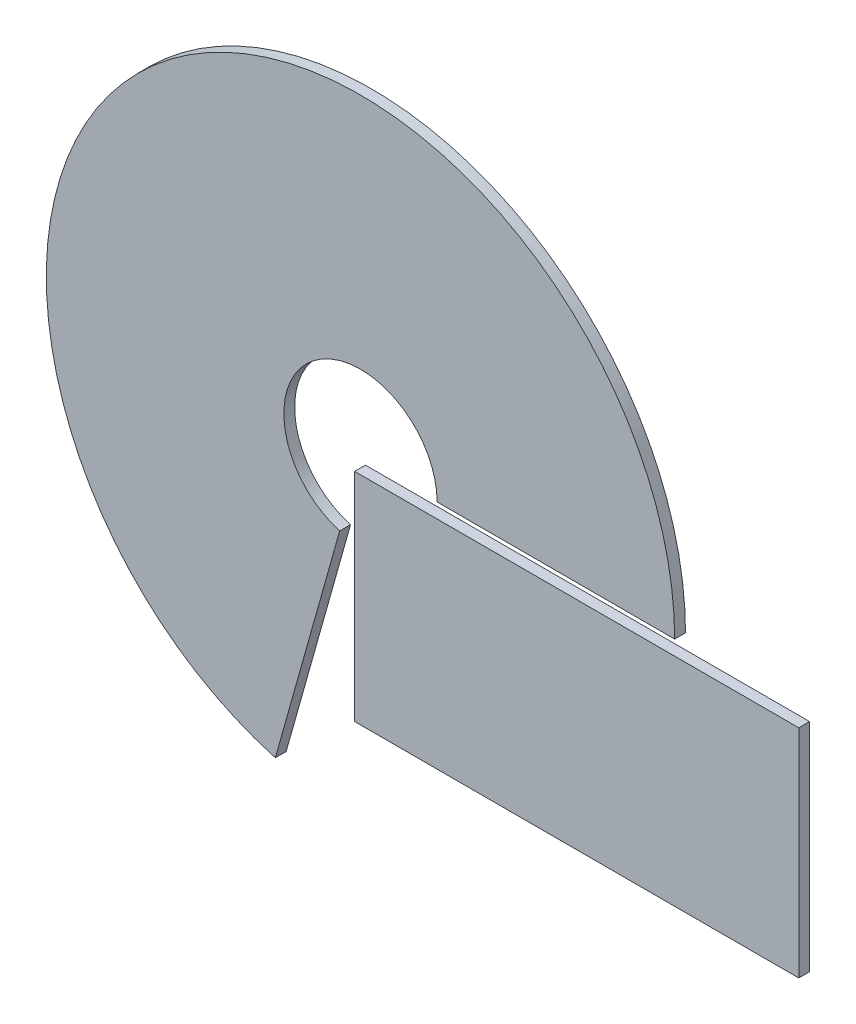
ISO-10303-21;
HEADER;
FILE_DESCRIPTION(('STEP AP214'),'2;1');
FILE_NAME('part.step','',(''),(''),'','','');
FILE_SCHEMA(('AUTOMOTIVE_DESIGN { 1 0 10303 214 1 1 1 1 }'));
ENDSEC;
DATA;
#1=APPLICATION_CONTEXT('core data for automotive mechanical design processes');
#2=APPLICATION_PROTOCOL_DEFINITION('international standard','automotive_design',2000,#1);
#3=PRODUCT_CONTEXT('',#1,'mechanical');
#4=PRODUCT('Part','Part','',(#3));
#5=PRODUCT_RELATED_PRODUCT_CATEGORY('part','',(#4));
#6=PRODUCT_DEFINITION_FORMATION('','',#4);
#7=PRODUCT_DEFINITION_CONTEXT('part definition',#1,'design');
#8=PRODUCT_DEFINITION('design','',#6,#7);
#9=PRODUCT_DEFINITION_SHAPE('','',#8);
#10=(LENGTH_UNIT() NAMED_UNIT(*) SI_UNIT(.MILLI.,.METRE.));
#11=(NAMED_UNIT(*) PLANE_ANGLE_UNIT() SI_UNIT($,.RADIAN.));
#12=(NAMED_UNIT(*) SI_UNIT($,.STERADIAN.) SOLID_ANGLE_UNIT());
#13=UNCERTAINTY_MEASURE_WITH_UNIT(LENGTH_MEASURE(1.E-05),#10,'distance_accuracy_value','');
#14=(GEOMETRIC_REPRESENTATION_CONTEXT(3) GLOBAL_UNCERTAINTY_ASSIGNED_CONTEXT((#13)) GLOBAL_UNIT_ASSIGNED_CONTEXT((#10,
#11,#12)) REPRESENTATION_CONTEXT('',''));
#15=CARTESIAN_POINT('',(0.,0.,0.));
#16=DIRECTION('',(0.,0.,1.));
#17=DIRECTION('',(1.,0.,0.));
#18=AXIS2_PLACEMENT_3D('',#15,#16,#17);
#19=CARTESIAN_POINT('',(-1.37917815760683,-54.2567420930345,2.54));
#20=DIRECTION('',(1.,0.,0.));
#21=DIRECTION('',(0.,0.,-1.));
#22=AXIS2_PLACEMENT_3D('',#19,#20,#21);
#23=PLANE('',#22);
#24=DIRECTION('',(0.,-1.,0.));
#25=VECTOR('',#24,1.);
#26=CARTESIAN_POINT('',(-1.37917815760683,-54.2567420930345,0.));
#27=LINE('',#26,#25);
#28=CARTESIAN_POINT('',(-1.37917815760683,-3.45674209303455,0.));
#29=VERTEX_POINT('',#28);
#30=CARTESIAN_POINT('',(-1.37917815760683,-54.2567420930345,0.));
#31=VERTEX_POINT('',#30);
#32=EDGE_CURVE('E112',#29,#31,#27,.T.);
#33=ORIENTED_EDGE('',*,*,#32,.T.);
#34=DIRECTION('',(0.,0.,-1.));
#35=VECTOR('',#34,1.);
#36=CARTESIAN_POINT('',(-1.37917815760683,-54.2567420930345,2.54));
#37=LINE('',#36,#35);
#38=CARTESIAN_POINT('',(-1.37917815760683,-54.2567420930345,2.54));
#39=VERTEX_POINT('',#38);
#40=EDGE_CURVE('E12',#39,#31,#37,.T.);
#41=ORIENTED_EDGE('',*,*,#40,.F.);
#42=DIRECTION('',(0.,-1.,0.));
#43=VECTOR('',#42,1.);
#44=CARTESIAN_POINT('',(-1.37917815760683,-54.2567420930345,2.54));
#45=LINE('',#44,#43);
#46=CARTESIAN_POINT('',(-1.37917815760683,-3.45674209303455,2.54));
#47=VERTEX_POINT('',#46);
#48=EDGE_CURVE('E100',#47,#39,#45,.T.);
#49=ORIENTED_EDGE('',*,*,#48,.F.);
#50=DIRECTION('',(0.,0.,-1.));
#51=VECTOR('',#50,1.);
#52=CARTESIAN_POINT('',(-1.37917815760683,-3.45674209303455,2.54));
#53=LINE('',#52,#51);
#54=EDGE_CURVE('E108',#47,#29,#53,.T.);
#55=ORIENTED_EDGE('',*,*,#54,.T.);
#56=EDGE_LOOP('',(#33,#41,#49,#55));
#57=FACE_BOUND('',#56,.T.);
#58=ADVANCED_FACE('F49',(#57),#23,.F.);
#59=CARTESIAN_POINT('',(-1.37917815760683,-54.2567420930345,2.54));
#60=DIRECTION('',(0.,1.,0.));
#61=DIRECTION('',(0.,0.,1.));
#62=AXIS2_PLACEMENT_3D('',#59,#60,#61);
#63=PLANE('',#62);
#64=DIRECTION('',(1.,0.,0.));
#65=VECTOR('',#64,1.);
#66=CARTESIAN_POINT('',(-1.37917815760683,-54.2567420930345,0.));
#67=LINE('',#66,#65);
#68=CARTESIAN_POINT('',(102.760821842393,-54.2567420930345,0.));
#69=VERTEX_POINT('',#68);
#70=EDGE_CURVE('E104',#31,#69,#67,.T.);
#71=ORIENTED_EDGE('',*,*,#70,.T.);
#72=DIRECTION('',(0.,0.,-1.));
#73=VECTOR('',#72,1.);
#74=CARTESIAN_POINT('',(102.760821842393,-54.2567420930345,2.54));
#75=LINE('',#74,#73);
#76=CARTESIAN_POINT('',(102.760821842393,-54.2567420930345,2.54));
#77=VERTEX_POINT('',#76);
#78=EDGE_CURVE('E57',#77,#69,#75,.T.);
#79=ORIENTED_EDGE('',*,*,#78,.F.);
#80=DIRECTION('',(1.,0.,0.));
#81=VECTOR('',#80,1.);
#82=CARTESIAN_POINT('',(-1.37917815760683,-54.2567420930345,2.54));
#83=LINE('',#82,#81);
#84=EDGE_CURVE('E95',#39,#77,#83,.T.);
#85=ORIENTED_EDGE('',*,*,#84,.F.);
#86=ORIENTED_EDGE('',*,*,#40,.T.);
#87=EDGE_LOOP('',(#71,#79,#85,#86));
#88=FACE_BOUND('',#87,.T.);
#89=ADVANCED_FACE('F103',(#88),#63,.F.);
#90=CARTESIAN_POINT('',(102.760821842393,-54.2567420930345,2.54));
#91=DIRECTION('',(-1.,0.,0.));
#92=DIRECTION('',(0.,0.,1.));
#93=AXIS2_PLACEMENT_3D('',#90,#91,#92);
#94=PLANE('',#93);
#95=DIRECTION('',(0.,1.,0.));
#96=VECTOR('',#95,1.);
#97=CARTESIAN_POINT('',(102.760821842393,-54.2567420930345,0.));
#98=LINE('',#97,#96);
#99=CARTESIAN_POINT('',(102.760821842393,-3.45674209303455,0.));
#100=VERTEX_POINT('',#99);
#101=EDGE_CURVE('E82',#69,#100,#98,.T.);
#102=ORIENTED_EDGE('',*,*,#101,.T.);
#103=DIRECTION('',(0.,0.,-1.));
#104=VECTOR('',#103,1.);
#105=CARTESIAN_POINT('',(102.760821842393,-3.45674209303455,2.54));
#106=LINE('',#105,#104);
#107=CARTESIAN_POINT('',(102.760821842393,-3.45674209303455,2.54));
#108=VERTEX_POINT('',#107);
#109=EDGE_CURVE('E105',#108,#100,#106,.T.);
#110=ORIENTED_EDGE('',*,*,#109,.F.);
#111=DIRECTION('',(0.,1.,0.));
#112=VECTOR('',#111,1.);
#113=CARTESIAN_POINT('',(102.760821842393,-54.2567420930345,2.54));
#114=LINE('',#113,#112);
#115=EDGE_CURVE('E98',#77,#108,#114,.T.);
#116=ORIENTED_EDGE('',*,*,#115,.F.);
#117=ORIENTED_EDGE('',*,*,#78,.T.);
#118=EDGE_LOOP('',(#102,#110,#116,#117));
#119=FACE_BOUND('',#118,.T.);
#120=ADVANCED_FACE('F106',(#119),#94,.F.);
#121=CARTESIAN_POINT('',(-1.37917815760683,-3.45674209303455,2.54));
#122=DIRECTION('',(0.,-1.,0.));
#123=DIRECTION('',(0.,0.,-1.));
#124=AXIS2_PLACEMENT_3D('',#121,#122,#123);
#125=PLANE('',#124);
#126=DIRECTION('',(-1.,0.,0.));
#127=VECTOR('',#126,1.);
#128=CARTESIAN_POINT('',(-1.37917815760683,-3.45674209303455,0.));
#129=LINE('',#128,#127);
#130=EDGE_CURVE('E88',#100,#29,#129,.T.);
#131=ORIENTED_EDGE('',*,*,#130,.T.);
#132=ORIENTED_EDGE('',*,*,#54,.F.);
#133=DIRECTION('',(-1.,0.,0.));
#134=VECTOR('',#133,1.);
#135=CARTESIAN_POINT('',(-1.37917815760683,-3.45674209303455,2.54));
#136=LINE('',#135,#134);
#137=EDGE_CURVE('E65',#108,#47,#136,.T.);
#138=ORIENTED_EDGE('',*,*,#137,.F.);
#139=ORIENTED_EDGE('',*,*,#109,.T.);
#140=EDGE_LOOP('',(#131,#132,#138,#139));
#141=FACE_BOUND('',#140,.T.);
#142=ADVANCED_FACE('F119',(#141),#125,.F.);
#143=CARTESIAN_POINT('',(0.,0.,2.54));
#144=DIRECTION('',(0.,0.,-1.));
#145=DIRECTION('',(-1.,0.,0.));
#146=AXIS2_PLACEMENT_3D('',#143,#144,#145);
#147=PLANE('',#146);
#148=ORIENTED_EDGE('',*,*,#48,.T.);
#149=ORIENTED_EDGE('',*,*,#84,.T.);
#150=ORIENTED_EDGE('',*,*,#115,.T.);
#151=ORIENTED_EDGE('',*,*,#137,.T.);
#152=EDGE_LOOP('',(#148,#149,#150,#151));
#153=FACE_BOUND('',#152,.T.);
#154=ADVANCED_FACE('F96',(#153),#147,.F.);
#155=CARTESIAN_POINT('',(0.,0.,0.));
#156=DIRECTION('',(0.,0.,-1.));
#157=DIRECTION('',(-1.,0.,0.));
#158=AXIS2_PLACEMENT_3D('',#155,#156,#157);
#159=PLANE('',#158);
#160=ORIENTED_EDGE('',*,*,#32,.F.);
#161=ORIENTED_EDGE('',*,*,#130,.F.);
#162=ORIENTED_EDGE('',*,*,#101,.F.);
#163=ORIENTED_EDGE('',*,*,#70,.F.);
#164=EDGE_LOOP('',(#160,#161,#162,#163));
#165=FACE_BOUND('',#164,.T.);
#166=ADVANCED_FACE('F122',(#165),#159,.T.);
#167=CLOSED_SHELL('',(#58,#89,#120,#142,#154,#166));
#168=MANIFOLD_SOLID_BREP('B2',#167);
#169=CARTESIAN_POINT('',(0.,0.,2.54));
#170=DIRECTION('',(0.,0.,-1.));
#171=DIRECTION('',(-1.,0.,0.));
#172=AXIS2_PLACEMENT_3D('',#169,#170,#171);
#173=CYLINDRICAL_SURFACE('',#172,17.9714374514374);
#174=CARTESIAN_POINT('',(0.,0.,0.));
#175=DIRECTION('',(0.,0.,-1.));
#176=DIRECTION('',(-1.,0.,0.));
#177=AXIS2_PLACEMENT_3D('',#174,#175,#176);
#178=CIRCLE('',#177,17.9714374514374);
#179=CARTESIAN_POINT('',(-4.87071261944741,-17.2988069718603,0.));
#180=VERTEX_POINT('',#179);
#181=CARTESIAN_POINT('',(17.9714374514374,0.,0.));
#182=VERTEX_POINT('',#181);
#183=EDGE_CURVE('E241',#180,#182,#178,.T.);
#184=ORIENTED_EDGE('',*,*,#183,.T.);
#185=DIRECTION('',(0.,0.,-1.));
#186=VECTOR('',#185,1.);
#187=CARTESIAN_POINT('',(17.9714374514374,0.,2.54));
#188=LINE('',#187,#186);
#189=CARTESIAN_POINT('',(17.9714374514374,0.,2.54));
#190=VERTEX_POINT('',#189);
#191=EDGE_CURVE('E47',#190,#182,#188,.T.);
#192=ORIENTED_EDGE('',*,*,#191,.F.);
#193=CARTESIAN_POINT('',(0.,0.,2.54));
#194=DIRECTION('',(0.,0.,-1.));
#195=DIRECTION('',(-1.,0.,0.));
#196=AXIS2_PLACEMENT_3D('',#193,#194,#195);
#197=CIRCLE('',#196,17.9714374514374);
#198=CARTESIAN_POINT('',(-4.87071261944741,-17.2988069718603,2.54));
#199=VERTEX_POINT('',#198);
#200=EDGE_CURVE('E225',#199,#190,#197,.T.);
#201=ORIENTED_EDGE('',*,*,#200,.F.);
#202=DIRECTION('',(0.,0.,-1.));
#203=VECTOR('',#202,1.);
#204=CARTESIAN_POINT('',(-4.87071261944741,-17.2988069718603,2.54));
#205=LINE('',#204,#203);
#206=EDGE_CURVE('E237',#199,#180,#205,.T.);
#207=ORIENTED_EDGE('',*,*,#206,.T.);
#208=EDGE_LOOP('',(#184,#192,#201,#207));
#209=FACE_BOUND('',#208,.T.);
#210=ADVANCED_FACE('F173',(#209),#173,.F.);
#211=CARTESIAN_POINT('',(17.9714374514374,0.,2.54));
#212=DIRECTION('',(0.,1.,0.));
#213=DIRECTION('',(0.,0.,1.));
#214=AXIS2_PLACEMENT_3D('',#211,#212,#213);
#215=PLANE('',#214);
#216=DIRECTION('',(1.,0.,0.));
#217=VECTOR('',#216,1.);
#218=CARTESIAN_POINT('',(17.9714374514374,0.,0.));
#219=LINE('',#218,#217);
#220=CARTESIAN_POINT('',(73.66,0.,0.));
#221=VERTEX_POINT('',#220);
#222=EDGE_CURVE('E230',#182,#221,#219,.T.);
#223=ORIENTED_EDGE('',*,*,#222,.T.);
#224=DIRECTION('',(0.,0.,-1.));
#225=VECTOR('',#224,1.);
#226=CARTESIAN_POINT('',(73.66,0.,2.54));
#227=LINE('',#226,#225);
#228=CARTESIAN_POINT('',(73.66,0.,2.54));
#229=VERTEX_POINT('',#228);
#230=EDGE_CURVE('E182',#229,#221,#227,.T.);
#231=ORIENTED_EDGE('',*,*,#230,.F.);
#232=DIRECTION('',(1.,0.,0.));
#233=VECTOR('',#232,1.);
#234=CARTESIAN_POINT('',(17.9714374514374,0.,2.54));
#235=LINE('',#234,#233);
#236=EDGE_CURVE('E220',#190,#229,#235,.T.);
#237=ORIENTED_EDGE('',*,*,#236,.F.);
#238=ORIENTED_EDGE('',*,*,#191,.T.);
#239=EDGE_LOOP('',(#223,#231,#237,#238));
#240=FACE_BOUND('',#239,.T.);
#241=ADVANCED_FACE('F229',(#240),#215,.F.);
#242=CARTESIAN_POINT('',(0.,0.,2.54));
#243=DIRECTION('',(0.,0.,-1.));
#244=DIRECTION('',(-1.,0.,0.));
#245=AXIS2_PLACEMENT_3D('',#242,#243,#244);
#246=CYLINDRICAL_SURFACE('',#245,73.66);
#247=CARTESIAN_POINT('',(0.,0.,0.));
#248=DIRECTION('',(0.,0.,1.));
#249=DIRECTION('',(-1.,0.,0.));
#250=AXIS2_PLACEMENT_3D('',#247,#248,#249);
#251=CIRCLE('',#250,73.66);
#252=CARTESIAN_POINT('',(-19.9637170102829,-70.903071887848,0.));
#253=VERTEX_POINT('',#252);
#254=EDGE_CURVE('E207',#221,#253,#251,.T.);
#255=ORIENTED_EDGE('',*,*,#254,.T.);
#256=DIRECTION('',(0.,0.,-1.));
#257=VECTOR('',#256,1.);
#258=CARTESIAN_POINT('',(-19.9637170102829,-70.903071887848,2.54));
#259=LINE('',#258,#257);
#260=CARTESIAN_POINT('',(-19.9637170102829,-70.903071887848,2.54));
#261=VERTEX_POINT('',#260);
#262=EDGE_CURVE('E232',#261,#253,#259,.T.);
#263=ORIENTED_EDGE('',*,*,#262,.F.);
#264=CARTESIAN_POINT('',(0.,0.,2.54));
#265=DIRECTION('',(0.,0.,1.));
#266=DIRECTION('',(-1.,0.,0.));
#267=AXIS2_PLACEMENT_3D('',#264,#265,#266);
#268=CIRCLE('',#267,73.66);
#269=EDGE_CURVE('E223',#229,#261,#268,.T.);
#270=ORIENTED_EDGE('',*,*,#269,.F.);
#271=ORIENTED_EDGE('',*,*,#230,.T.);
#272=EDGE_LOOP('',(#255,#263,#270,#271));
#273=FACE_BOUND('',#272,.T.);
#274=ADVANCED_FACE('F233',(#273),#246,.T.);
#275=CARTESIAN_POINT('',(-19.9637170102829,-70.903071887848,2.54));
#276=DIRECTION('',(-0.96257224935987,0.271025210565882,0.));
#277=DIRECTION('',(-0.271025210565882,-0.96257224935987,0.));
#278=AXIS2_PLACEMENT_3D('',#275,#276,#277);
#279=PLANE('',#278);
#280=DIRECTION('',(0.271025210565882,0.96257224935987,0.));
#281=VECTOR('',#280,1.);
#282=CARTESIAN_POINT('',(-19.9637170102829,-70.903071887848,0.));
#283=LINE('',#282,#281);
#284=EDGE_CURVE('E213',#253,#180,#283,.T.);
#285=ORIENTED_EDGE('',*,*,#284,.T.);
#286=ORIENTED_EDGE('',*,*,#206,.F.);
#287=DIRECTION('',(0.271025210565882,0.96257224935987,0.));
#288=VECTOR('',#287,1.);
#289=CARTESIAN_POINT('',(-19.9637170102829,-70.903071887848,2.54));
#290=LINE('',#289,#288);
#291=EDGE_CURVE('E190',#261,#199,#290,.T.);
#292=ORIENTED_EDGE('',*,*,#291,.F.);
#293=ORIENTED_EDGE('',*,*,#262,.T.);
#294=EDGE_LOOP('',(#285,#286,#292,#293));
#295=FACE_BOUND('',#294,.T.);
#296=ADVANCED_FACE('F254',(#295),#279,.F.);
#297=CARTESIAN_POINT('',(0.,0.,2.54));
#298=DIRECTION('',(0.,0.,-1.));
#299=DIRECTION('',(-1.,0.,0.));
#300=AXIS2_PLACEMENT_3D('',#297,#298,#299);
#301=PLANE('',#300);
#302=ORIENTED_EDGE('',*,*,#200,.T.);
#303=ORIENTED_EDGE('',*,*,#236,.T.);
#304=ORIENTED_EDGE('',*,*,#269,.T.);
#305=ORIENTED_EDGE('',*,*,#291,.T.);
#306=EDGE_LOOP('',(#302,#303,#304,#305));
#307=FACE_BOUND('',#306,.T.);
#308=ADVANCED_FACE('F221',(#307),#301,.F.);
#309=CARTESIAN_POINT('',(0.,0.,0.));
#310=DIRECTION('',(0.,0.,-1.));
#311=DIRECTION('',(-1.,0.,0.));
#312=AXIS2_PLACEMENT_3D('',#309,#310,#311);
#313=PLANE('',#312);
#314=ORIENTED_EDGE('',*,*,#183,.F.);
#315=ORIENTED_EDGE('',*,*,#284,.F.);
#316=ORIENTED_EDGE('',*,*,#254,.F.);
#317=ORIENTED_EDGE('',*,*,#222,.F.);
#318=EDGE_LOOP('',(#314,#315,#316,#317));
#319=FACE_BOUND('',#318,.T.);
#320=ADVANCED_FACE('F257',(#319),#313,.T.);
#321=CLOSED_SHELL('',(#210,#241,#274,#296,#308,#320));
#322=MANIFOLD_SOLID_BREP('B6',#321);
#323=ADVANCED_BREP_SHAPE_REPRESENTATION('',(#18,#168,#322),#14);
#324=SHAPE_DEFINITION_REPRESENTATION(#9,#323);
ENDSEC;
END-ISO-10303-21;
